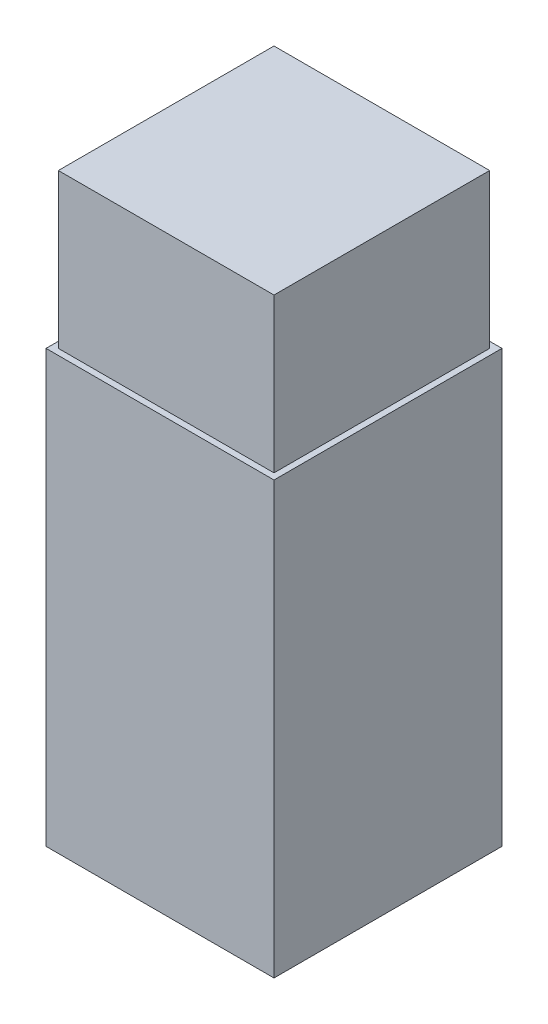
ISO-10303-21;
HEADER;
FILE_DESCRIPTION(('STEP AP214'),'2;1');
FILE_NAME('part.step','',(''),(''),'','','');
FILE_SCHEMA(('AUTOMOTIVE_DESIGN { 1 0 10303 214 1 1 1 1 }'));
ENDSEC;
DATA;
#1=APPLICATION_CONTEXT('core data for automotive mechanical design processes');
#2=APPLICATION_PROTOCOL_DEFINITION('international standard','automotive_design',2000,#1);
#3=PRODUCT_CONTEXT('',#1,'mechanical');
#4=PRODUCT('Part','Part','',(#3));
#5=PRODUCT_RELATED_PRODUCT_CATEGORY('part','',(#4));
#6=PRODUCT_DEFINITION_FORMATION('','',#4);
#7=PRODUCT_DEFINITION_CONTEXT('part definition',#1,'design');
#8=PRODUCT_DEFINITION('design','',#6,#7);
#9=PRODUCT_DEFINITION_SHAPE('','',#8);
#10=(LENGTH_UNIT() NAMED_UNIT(*) SI_UNIT(.MILLI.,.METRE.));
#11=(NAMED_UNIT(*) PLANE_ANGLE_UNIT() SI_UNIT($,.RADIAN.));
#12=(NAMED_UNIT(*) SI_UNIT($,.STERADIAN.) SOLID_ANGLE_UNIT());
#13=UNCERTAINTY_MEASURE_WITH_UNIT(LENGTH_MEASURE(1.E-05),#10,'distance_accuracy_value','');
#14=(GEOMETRIC_REPRESENTATION_CONTEXT(3) GLOBAL_UNCERTAINTY_ASSIGNED_CONTEXT((#13)) GLOBAL_UNIT_ASSIGNED_CONTEXT((#10,
#11,#12)) REPRESENTATION_CONTEXT('',''));
#15=CARTESIAN_POINT('',(0.,0.,0.));
#16=DIRECTION('',(0.,0.,1.));
#17=DIRECTION('',(1.,0.,0.));
#18=AXIS2_PLACEMENT_3D('',#15,#16,#17);
#19=CARTESIAN_POINT('',(0.,70.,0.));
#20=DIRECTION('',(0.,-1.,0.));
#21=DIRECTION('',(0.,0.,-1.));
#22=AXIS2_PLACEMENT_3D('',#19,#20,#21);
#23=PLANE('',#22);
#24=DIRECTION('',(0.,0.,1.));
#25=VECTOR('',#24,1.);
#26=CARTESIAN_POINT('',(0.,70.,0.));
#27=LINE('',#26,#25);
#28=CARTESIAN_POINT('',(0.,70.,-37.));
#29=VERTEX_POINT('',#28);
#30=CARTESIAN_POINT('',(0.,70.,0.));
#31=VERTEX_POINT('',#30);
#32=EDGE_CURVE('E139',#29,#31,#27,.T.);
#33=ORIENTED_EDGE('',*,*,#32,.T.);
#34=DIRECTION('',(1.,0.,0.));
#35=VECTOR('',#34,1.);
#36=CARTESIAN_POINT('',(0.,70.,0.));
#37=LINE('',#36,#35);
#38=CARTESIAN_POINT('',(37.,70.,0.));
#39=VERTEX_POINT('',#38);
#40=EDGE_CURVE('E143',#31,#39,#37,.T.);
#41=ORIENTED_EDGE('',*,*,#40,.T.);
#42=DIRECTION('',(0.,0.,-1.));
#43=VECTOR('',#42,1.);
#44=CARTESIAN_POINT('',(37.,70.,0.));
#45=LINE('',#44,#43);
#46=CARTESIAN_POINT('',(37.,70.,-37.));
#47=VERTEX_POINT('',#46);
#48=EDGE_CURVE('E147',#39,#47,#45,.T.);
#49=ORIENTED_EDGE('',*,*,#48,.T.);
#50=DIRECTION('',(-1.,0.,0.));
#51=VECTOR('',#50,1.);
#52=CARTESIAN_POINT('',(0.,70.,-37.));
#53=LINE('',#52,#51);
#54=EDGE_CURVE('E150',#47,#29,#53,.T.);
#55=ORIENTED_EDGE('',*,*,#54,.T.);
#56=EDGE_LOOP('',(#33,#41,#49,#55));
#57=FACE_BOUND('',#56,.T.);
#58=DIRECTION('',(0.,0.,1.));
#59=VECTOR('',#58,1.);
#60=CARTESIAN_POINT('',(1.,70.,-1.));
#61=LINE('',#60,#59);
#62=CARTESIAN_POINT('',(1.,70.,-36.));
#63=VERTEX_POINT('',#62);
#64=CARTESIAN_POINT('',(1.,70.,-1.));
#65=VERTEX_POINT('',#64);
#66=EDGE_CURVE('E55',#63,#65,#61,.T.);
#67=ORIENTED_EDGE('',*,*,#66,.F.);
#68=DIRECTION('',(-1.,0.,0.));
#69=VECTOR('',#68,1.);
#70=CARTESIAN_POINT('',(1.,70.,-36.));
#71=LINE('',#70,#69);
#72=CARTESIAN_POINT('',(36.,70.,-36.));
#73=VERTEX_POINT('',#72);
#74=EDGE_CURVE('E59',#73,#63,#71,.T.);
#75=ORIENTED_EDGE('',*,*,#74,.F.);
#76=DIRECTION('',(0.,0.,-1.));
#77=VECTOR('',#76,1.);
#78=CARTESIAN_POINT('',(36.,70.,-1.));
#79=LINE('',#78,#77);
#80=CARTESIAN_POINT('',(36.,70.,-1.));
#81=VERTEX_POINT('',#80);
#82=EDGE_CURVE('E283',#81,#73,#79,.T.);
#83=ORIENTED_EDGE('',*,*,#82,.F.);
#84=DIRECTION('',(1.,0.,0.));
#85=VECTOR('',#84,1.);
#86=CARTESIAN_POINT('',(1.,70.,-1.));
#87=LINE('',#86,#85);
#88=EDGE_CURVE('E293',#65,#81,#87,.T.);
#89=ORIENTED_EDGE('',*,*,#88,.F.);
#90=EDGE_LOOP('',(#67,#75,#83,#89));
#91=FACE_BOUND('',#90,.T.);
#92=ADVANCED_FACE('F39',(#57,#91),#23,.F.);
#93=CARTESIAN_POINT('',(0.,70.,0.));
#94=DIRECTION('',(1.,0.,0.));
#95=DIRECTION('',(0.,0.,-1.));
#96=AXIS2_PLACEMENT_3D('',#93,#94,#95);
#97=PLANE('',#96);
#98=DIRECTION('',(0.,0.,1.));
#99=VECTOR('',#98,1.);
#100=CARTESIAN_POINT('',(0.,0.,0.));
#101=LINE('',#100,#99);
#102=CARTESIAN_POINT('',(0.,0.,-37.));
#103=VERTEX_POINT('',#102);
#104=CARTESIAN_POINT('',(0.,0.,0.));
#105=VERTEX_POINT('',#104);
#106=EDGE_CURVE('E128',#103,#105,#101,.T.);
#107=ORIENTED_EDGE('',*,*,#106,.T.);
#108=DIRECTION('',(0.,-1.,0.));
#109=VECTOR('',#108,1.);
#110=CARTESIAN_POINT('',(0.,70.,0.));
#111=LINE('',#110,#109);
#112=EDGE_CURVE('E11',#31,#105,#111,.T.);
#113=ORIENTED_EDGE('',*,*,#112,.F.);
#114=ORIENTED_EDGE('',*,*,#32,.F.);
#115=DIRECTION('',(0.,-1.,0.));
#116=VECTOR('',#115,1.);
#117=CARTESIAN_POINT('',(0.,70.,-37.));
#118=LINE('',#117,#116);
#119=EDGE_CURVE('E152',#29,#103,#118,.T.);
#120=ORIENTED_EDGE('',*,*,#119,.T.);
#121=EDGE_LOOP('',(#107,#113,#114,#120));
#122=FACE_BOUND('',#121,.T.);
#123=ADVANCED_FACE('F41',(#122),#97,.F.);
#124=CARTESIAN_POINT('',(0.,70.,0.));
#125=DIRECTION('',(0.,0.,-1.));
#126=DIRECTION('',(-1.,0.,0.));
#127=AXIS2_PLACEMENT_3D('',#124,#125,#126);
#128=PLANE('',#127);
#129=DIRECTION('',(1.,0.,0.));
#130=VECTOR('',#129,1.);
#131=CARTESIAN_POINT('',(0.,0.,0.));
#132=LINE('',#131,#130);
#133=CARTESIAN_POINT('',(37.,0.,0.));
#134=VERTEX_POINT('',#133);
#135=EDGE_CURVE('E133',#105,#134,#132,.T.);
#136=ORIENTED_EDGE('',*,*,#135,.T.);
#137=DIRECTION('',(0.,-1.,0.));
#138=VECTOR('',#137,1.);
#139=CARTESIAN_POINT('',(37.,70.,0.));
#140=LINE('',#139,#138);
#141=EDGE_CURVE('E48',#39,#134,#140,.T.);
#142=ORIENTED_EDGE('',*,*,#141,.F.);
#143=ORIENTED_EDGE('',*,*,#40,.F.);
#144=ORIENTED_EDGE('',*,*,#112,.T.);
#145=EDGE_LOOP('',(#136,#142,#143,#144));
#146=FACE_BOUND('',#145,.T.);
#147=ADVANCED_FACE('F188',(#146),#128,.F.);
#148=CARTESIAN_POINT('',(37.,70.,0.));
#149=DIRECTION('',(-1.,0.,0.));
#150=DIRECTION('',(0.,0.,1.));
#151=AXIS2_PLACEMENT_3D('',#148,#149,#150);
#152=PLANE('',#151);
#153=DIRECTION('',(0.,0.,-1.));
#154=VECTOR('',#153,1.);
#155=CARTESIAN_POINT('',(37.,0.,0.));
#156=LINE('',#155,#154);
#157=CARTESIAN_POINT('',(37.,0.,-37.));
#158=VERTEX_POINT('',#157);
#159=EDGE_CURVE('E156',#134,#158,#156,.T.);
#160=ORIENTED_EDGE('',*,*,#159,.T.);
#161=DIRECTION('',(0.,-1.,0.));
#162=VECTOR('',#161,1.);
#163=CARTESIAN_POINT('',(37.,70.,-37.));
#164=LINE('',#163,#162);
#165=EDGE_CURVE('E164',#47,#158,#164,.T.);
#166=ORIENTED_EDGE('',*,*,#165,.F.);
#167=ORIENTED_EDGE('',*,*,#48,.F.);
#168=ORIENTED_EDGE('',*,*,#141,.T.);
#169=EDGE_LOOP('',(#160,#166,#167,#168));
#170=FACE_BOUND('',#169,.T.);
#171=ADVANCED_FACE('F173',(#170),#152,.F.);
#172=CARTESIAN_POINT('',(0.,70.,-37.));
#173=DIRECTION('',(0.,0.,1.));
#174=DIRECTION('',(1.,0.,0.));
#175=AXIS2_PLACEMENT_3D('',#172,#173,#174);
#176=PLANE('',#175);
#177=DIRECTION('',(-1.,0.,0.));
#178=VECTOR('',#177,1.);
#179=CARTESIAN_POINT('',(0.,0.,-37.));
#180=LINE('',#179,#178);
#181=EDGE_CURVE('E144',#158,#103,#180,.T.);
#182=ORIENTED_EDGE('',*,*,#181,.T.);
#183=ORIENTED_EDGE('',*,*,#119,.F.);
#184=ORIENTED_EDGE('',*,*,#54,.F.);
#185=ORIENTED_EDGE('',*,*,#165,.T.);
#186=EDGE_LOOP('',(#182,#183,#184,#185));
#187=FACE_BOUND('',#186,.T.);
#188=ADVANCED_FACE('F182',(#187),#176,.F.);
#189=CARTESIAN_POINT('',(0.,0.,0.));
#190=DIRECTION('',(0.,-1.,0.));
#191=DIRECTION('',(0.,0.,-1.));
#192=AXIS2_PLACEMENT_3D('',#189,#190,#191);
#193=PLANE('',#192);
#194=ORIENTED_EDGE('',*,*,#106,.F.);
#195=ORIENTED_EDGE('',*,*,#181,.F.);
#196=ORIENTED_EDGE('',*,*,#159,.F.);
#197=ORIENTED_EDGE('',*,*,#135,.F.);
#198=EDGE_LOOP('',(#194,#195,#196,#197));
#199=FACE_BOUND('',#198,.T.);
#200=ADVANCED_FACE('F179',(#199),#193,.T.);
#201=CARTESIAN_POINT('',(1.,95.,-1.));
#202=DIRECTION('',(1.,0.,0.));
#203=DIRECTION('',(0.,0.,-1.));
#204=AXIS2_PLACEMENT_3D('',#201,#202,#203);
#205=PLANE('',#204);
#206=ORIENTED_EDGE('',*,*,#66,.T.);
#207=DIRECTION('',(0.,-1.,0.));
#208=VECTOR('',#207,1.);
#209=CARTESIAN_POINT('',(1.,95.,-1.));
#210=LINE('',#209,#208);
#211=CARTESIAN_POINT('',(1.,95.,-1.));
#212=VERTEX_POINT('',#211);
#213=EDGE_CURVE('E108',#212,#65,#210,.T.);
#214=ORIENTED_EDGE('',*,*,#213,.F.);
#215=DIRECTION('',(0.,0.,1.));
#216=VECTOR('',#215,1.);
#217=CARTESIAN_POINT('',(1.,95.,-1.));
#218=LINE('',#217,#216);
#219=CARTESIAN_POINT('',(1.,95.,-36.));
#220=VERTEX_POINT('',#219);
#221=EDGE_CURVE('E115',#220,#212,#218,.T.);
#222=ORIENTED_EDGE('',*,*,#221,.F.);
#223=DIRECTION('',(0.,-1.,0.));
#224=VECTOR('',#223,1.);
#225=CARTESIAN_POINT('',(1.,95.,-36.));
#226=LINE('',#225,#224);
#227=EDGE_CURVE('E280',#220,#63,#226,.T.);
#228=ORIENTED_EDGE('',*,*,#227,.T.);
#229=EDGE_LOOP('',(#206,#214,#222,#228));
#230=FACE_BOUND('',#229,.T.);
#231=ADVANCED_FACE('F126',(#230),#205,.F.);
#232=CARTESIAN_POINT('',(1.,95.,-1.));
#233=DIRECTION('',(0.,0.,-1.));
#234=DIRECTION('',(-1.,0.,0.));
#235=AXIS2_PLACEMENT_3D('',#232,#233,#234);
#236=PLANE('',#235);
#237=ORIENTED_EDGE('',*,*,#88,.T.);
#238=DIRECTION('',(0.,-1.,0.));
#239=VECTOR('',#238,1.);
#240=CARTESIAN_POINT('',(36.,95.,-1.));
#241=LINE('',#240,#239);
#242=CARTESIAN_POINT('',(36.,95.,-1.));
#243=VERTEX_POINT('',#242);
#244=EDGE_CURVE('E110',#243,#81,#241,.T.);
#245=ORIENTED_EDGE('',*,*,#244,.F.);
#246=DIRECTION('',(1.,0.,0.));
#247=VECTOR('',#246,1.);
#248=CARTESIAN_POINT('',(1.,95.,-1.));
#249=LINE('',#248,#247);
#250=EDGE_CURVE('E103',#212,#243,#249,.T.);
#251=ORIENTED_EDGE('',*,*,#250,.F.);
#252=ORIENTED_EDGE('',*,*,#213,.T.);
#253=EDGE_LOOP('',(#237,#245,#251,#252));
#254=FACE_BOUND('',#253,.T.);
#255=ADVANCED_FACE('F106',(#254),#236,.F.);
#256=CARTESIAN_POINT('',(36.,95.,-1.));
#257=DIRECTION('',(-1.,0.,0.));
#258=DIRECTION('',(0.,0.,1.));
#259=AXIS2_PLACEMENT_3D('',#256,#257,#258);
#260=PLANE('',#259);
#261=ORIENTED_EDGE('',*,*,#82,.T.);
#262=DIRECTION('',(0.,-1.,0.));
#263=VECTOR('',#262,1.);
#264=CARTESIAN_POINT('',(36.,95.,-36.));
#265=LINE('',#264,#263);
#266=CARTESIAN_POINT('',(36.,95.,-36.));
#267=VERTEX_POINT('',#266);
#268=EDGE_CURVE('E135',#267,#73,#265,.T.);
#269=ORIENTED_EDGE('',*,*,#268,.F.);
#270=DIRECTION('',(0.,0.,-1.));
#271=VECTOR('',#270,1.);
#272=CARTESIAN_POINT('',(36.,95.,-1.));
#273=LINE('',#272,#271);
#274=EDGE_CURVE('E114',#243,#267,#273,.T.);
#275=ORIENTED_EDGE('',*,*,#274,.F.);
#276=ORIENTED_EDGE('',*,*,#244,.T.);
#277=EDGE_LOOP('',(#261,#269,#275,#276));
#278=FACE_BOUND('',#277,.T.);
#279=ADVANCED_FACE('F224',(#278),#260,.F.);
#280=CARTESIAN_POINT('',(1.,95.,-36.));
#281=DIRECTION('',(0.,0.,1.));
#282=DIRECTION('',(1.,0.,0.));
#283=AXIS2_PLACEMENT_3D('',#280,#281,#282);
#284=PLANE('',#283);
#285=ORIENTED_EDGE('',*,*,#74,.T.);
#286=ORIENTED_EDGE('',*,*,#227,.F.);
#287=DIRECTION('',(-1.,0.,0.));
#288=VECTOR('',#287,1.);
#289=CARTESIAN_POINT('',(1.,95.,-36.));
#290=LINE('',#289,#288);
#291=EDGE_CURVE('E120',#267,#220,#290,.T.);
#292=ORIENTED_EDGE('',*,*,#291,.F.);
#293=ORIENTED_EDGE('',*,*,#268,.T.);
#294=EDGE_LOOP('',(#285,#286,#292,#293));
#295=FACE_BOUND('',#294,.T.);
#296=ADVANCED_FACE('F230',(#295),#284,.F.);
#297=CARTESIAN_POINT('',(0.,95.,0.));
#298=DIRECTION('',(0.,-1.,0.));
#299=DIRECTION('',(0.,0.,-1.));
#300=AXIS2_PLACEMENT_3D('',#297,#298,#299);
#301=PLANE('',#300);
#302=ORIENTED_EDGE('',*,*,#221,.T.);
#303=ORIENTED_EDGE('',*,*,#250,.T.);
#304=ORIENTED_EDGE('',*,*,#274,.T.);
#305=ORIENTED_EDGE('',*,*,#291,.T.);
#306=EDGE_LOOP('',(#302,#303,#304,#305));
#307=FACE_BOUND('',#306,.T.);
#308=ADVANCED_FACE('F118',(#307),#301,.F.);
#309=CLOSED_SHELL('',(#92,#123,#147,#171,#188,#200,#231,#255,#279,#296,#308));
#310=MANIFOLD_SOLID_BREP('B2',#309);
#311=ADVANCED_BREP_SHAPE_REPRESENTATION('',(#18,#310),#14);
#312=SHAPE_DEFINITION_REPRESENTATION(#9,#311);
ENDSEC;
END-ISO-10303-21;
